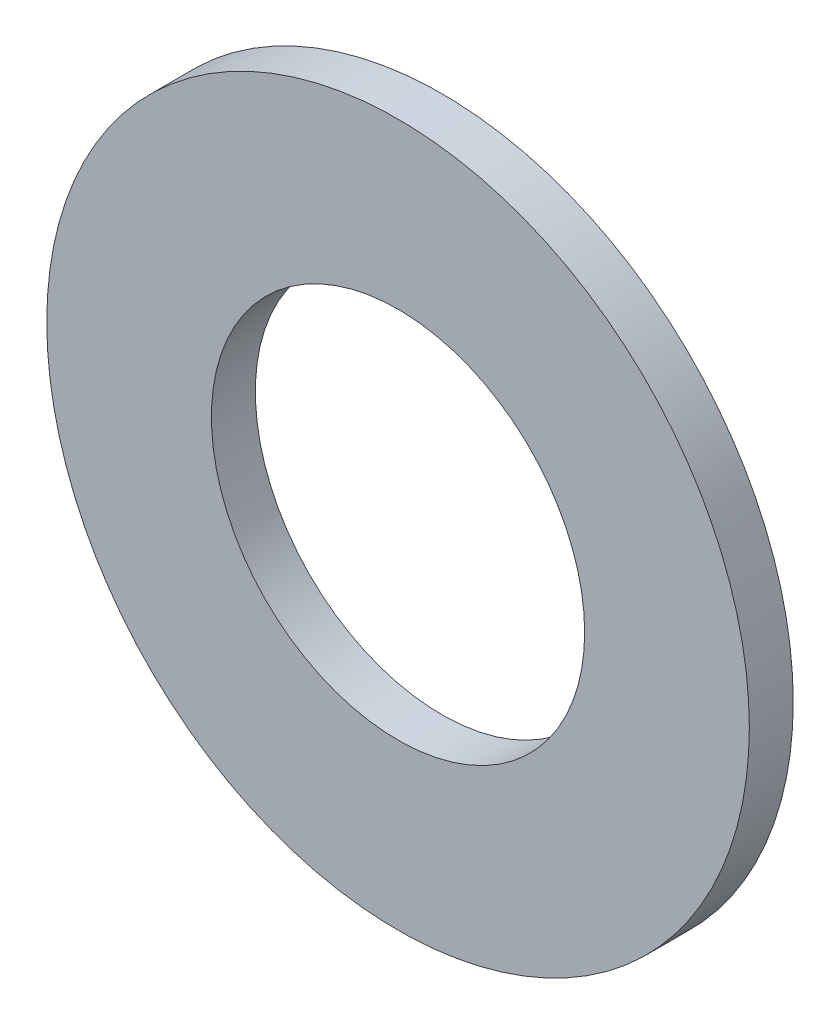
ISO-10303-21;
HEADER;
FILE_DESCRIPTION(('STEP AP214'),'2;1');
FILE_NAME('part.step','',(''),(''),'','','');
FILE_SCHEMA(('AUTOMOTIVE_DESIGN { 1 0 10303 214 1 1 1 1 }'));
ENDSEC;
DATA;
#1=APPLICATION_CONTEXT('core data for automotive mechanical design processes');
#2=APPLICATION_PROTOCOL_DEFINITION('international standard','automotive_design',2000,#1);
#3=PRODUCT_CONTEXT('',#1,'mechanical');
#4=PRODUCT('Part','Part','',(#3));
#5=PRODUCT_RELATED_PRODUCT_CATEGORY('part','',(#4));
#6=PRODUCT_DEFINITION_FORMATION('','',#4);
#7=PRODUCT_DEFINITION_CONTEXT('part definition',#1,'design');
#8=PRODUCT_DEFINITION('design','',#6,#7);
#9=PRODUCT_DEFINITION_SHAPE('','',#8);
#10=(LENGTH_UNIT() NAMED_UNIT(*) SI_UNIT(.MILLI.,.METRE.));
#11=(NAMED_UNIT(*) PLANE_ANGLE_UNIT() SI_UNIT($,.RADIAN.));
#12=(NAMED_UNIT(*) SI_UNIT($,.STERADIAN.) SOLID_ANGLE_UNIT());
#13=UNCERTAINTY_MEASURE_WITH_UNIT(LENGTH_MEASURE(1.E-05),#10,'distance_accuracy_value','');
#14=(GEOMETRIC_REPRESENTATION_CONTEXT(3) GLOBAL_UNCERTAINTY_ASSIGNED_CONTEXT((#13)) GLOBAL_UNIT_ASSIGNED_CONTEXT((#10,
#11,#12)) REPRESENTATION_CONTEXT('',''));
#15=CARTESIAN_POINT('',(0.,0.,0.));
#16=DIRECTION('',(0.,0.,1.));
#17=DIRECTION('',(1.,0.,0.));
#18=AXIS2_PLACEMENT_3D('',#15,#16,#17);
#19=CARTESIAN_POINT('',(0.,0.,1.));
#20=DIRECTION('',(0.,0.,1.));
#21=DIRECTION('',(1.,0.,0.));
#22=AXIS2_PLACEMENT_3D('',#19,#20,#21);
#23=PLANE('',#22);
#24=CARTESIAN_POINT('',(0.,0.,1.));
#25=DIRECTION('',(0.,0.,1.));
#26=DIRECTION('',(1.,0.,0.));
#27=AXIS2_PLACEMENT_3D('',#24,#25,#26);
#28=CIRCLE('',#27,8.);
#29=CARTESIAN_POINT('',(8.,0.,1.));
#30=VERTEX_POINT('',#29);
#31=EDGE_CURVE('E10',#30,#30,#28,.T.);
#32=ORIENTED_EDGE('',*,*,#31,.T.);
#33=EDGE_LOOP('',(#32));
#34=FACE_BOUND('',#33,.T.);
#35=CARTESIAN_POINT('',(0.,0.,1.));
#36=DIRECTION('',(0.,0.,1.));
#37=DIRECTION('',(1.,0.,0.));
#38=AXIS2_PLACEMENT_3D('',#35,#36,#37);
#39=CIRCLE('',#38,4.25);
#40=CARTESIAN_POINT('',(4.25,0.,1.));
#41=VERTEX_POINT('',#40);
#42=EDGE_CURVE('E39',#41,#41,#39,.T.);
#43=ORIENTED_EDGE('',*,*,#42,.F.);
#44=EDGE_LOOP('',(#43));
#45=FACE_BOUND('',#44,.T.);
#46=ADVANCED_FACE('F28',(#34,#45),#23,.T.);
#47=CARTESIAN_POINT('',(0.,0.,0.));
#48=DIRECTION('',(0.,0.,1.));
#49=DIRECTION('',(1.,0.,0.));
#50=AXIS2_PLACEMENT_3D('',#47,#48,#49);
#51=PLANE('',#50);
#52=CARTESIAN_POINT('',(0.,0.,0.));
#53=DIRECTION('',(0.,0.,1.));
#54=DIRECTION('',(1.,0.,0.));
#55=AXIS2_PLACEMENT_3D('',#52,#53,#54);
#56=CIRCLE('',#55,8.);
#57=CARTESIAN_POINT('',(8.,0.,0.));
#58=VERTEX_POINT('',#57);
#59=EDGE_CURVE('E32',#58,#58,#56,.T.);
#60=ORIENTED_EDGE('',*,*,#59,.F.);
#61=EDGE_LOOP('',(#60));
#62=FACE_BOUND('',#61,.T.);
#63=CARTESIAN_POINT('',(0.,0.,0.));
#64=DIRECTION('',(0.,0.,1.));
#65=DIRECTION('',(1.,0.,0.));
#66=AXIS2_PLACEMENT_3D('',#63,#64,#65);
#67=CIRCLE('',#66,4.25);
#68=CARTESIAN_POINT('',(4.25,0.,0.));
#69=VERTEX_POINT('',#68);
#70=EDGE_CURVE('E41',#69,#69,#67,.T.);
#71=ORIENTED_EDGE('',*,*,#70,.T.);
#72=EDGE_LOOP('',(#71));
#73=FACE_BOUND('',#72,.T.);
#74=ADVANCED_FACE('F51',(#62,#73),#51,.F.);
#75=CARTESIAN_POINT('',(0.,0.,1.));
#76=DIRECTION('',(0.,0.,-1.));
#77=DIRECTION('',(-1.,0.,0.));
#78=AXIS2_PLACEMENT_3D('',#75,#76,#77);
#79=CYLINDRICAL_SURFACE('',#78,8.);
#80=ORIENTED_EDGE('',*,*,#31,.F.);
#81=EDGE_LOOP('',(#80));
#82=FACE_BOUND('',#81,.T.);
#83=ORIENTED_EDGE('',*,*,#59,.T.);
#84=EDGE_LOOP('',(#83));
#85=FACE_BOUND('',#84,.T.);
#86=ADVANCED_FACE('F30',(#82,#85),#79,.T.);
#87=CARTESIAN_POINT('',(0.,0.,1.));
#88=DIRECTION('',(0.,0.,-1.));
#89=DIRECTION('',(-1.,0.,0.));
#90=AXIS2_PLACEMENT_3D('',#87,#88,#89);
#91=CYLINDRICAL_SURFACE('',#90,4.25);
#92=ORIENTED_EDGE('',*,*,#42,.T.);
#93=EDGE_LOOP('',(#92));
#94=FACE_BOUND('',#93,.T.);
#95=ORIENTED_EDGE('',*,*,#70,.F.);
#96=EDGE_LOOP('',(#95));
#97=FACE_BOUND('',#96,.T.);
#98=ADVANCED_FACE('F47',(#94,#97),#91,.F.);
#99=CLOSED_SHELL('',(#46,#74,#86,#98));
#100=MANIFOLD_SOLID_BREP('B2',#99);
#101=ADVANCED_BREP_SHAPE_REPRESENTATION('',(#18,#100),#14);
#102=SHAPE_DEFINITION_REPRESENTATION(#9,#101);
ENDSEC;
END-ISO-10303-21;
